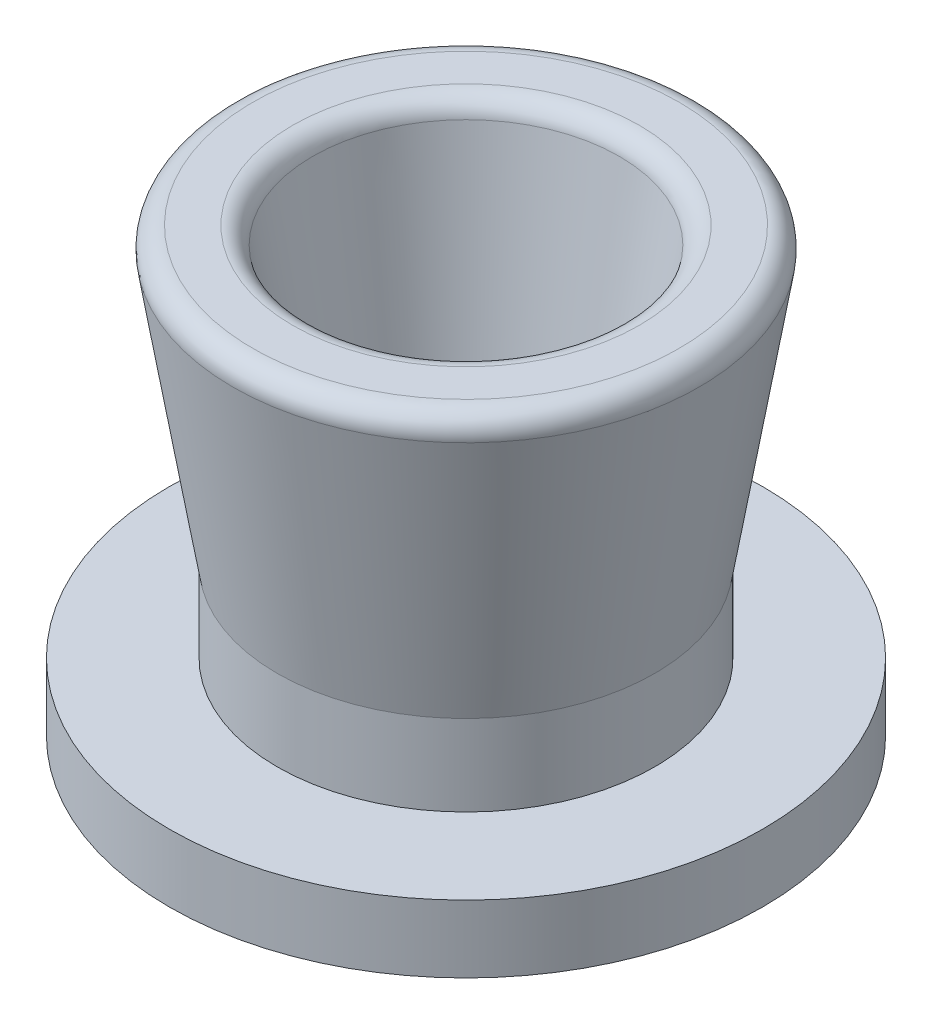
ISO-10303-21;
HEADER;
FILE_DESCRIPTION(('STEP AP214'),'2;1');
FILE_NAME('part.step','',(''),(''),'','','');
FILE_SCHEMA(('AUTOMOTIVE_DESIGN { 1 0 10303 214 1 1 1 1 }'));
ENDSEC;
DATA;
#1=APPLICATION_CONTEXT('core data for automotive mechanical design processes');
#2=APPLICATION_PROTOCOL_DEFINITION('international standard','automotive_design',2000,#1);
#3=PRODUCT_CONTEXT('',#1,'mechanical');
#4=PRODUCT('Part','Part','',(#3));
#5=PRODUCT_RELATED_PRODUCT_CATEGORY('part','',(#4));
#6=PRODUCT_DEFINITION_FORMATION('','',#4);
#7=PRODUCT_DEFINITION_CONTEXT('part definition',#1,'design');
#8=PRODUCT_DEFINITION('design','',#6,#7);
#9=PRODUCT_DEFINITION_SHAPE('','',#8);
#10=(LENGTH_UNIT() NAMED_UNIT(*) SI_UNIT(.MILLI.,.METRE.));
#11=(NAMED_UNIT(*) PLANE_ANGLE_UNIT() SI_UNIT($,.RADIAN.));
#12=(NAMED_UNIT(*) SI_UNIT($,.STERADIAN.) SOLID_ANGLE_UNIT());
#13=UNCERTAINTY_MEASURE_WITH_UNIT(LENGTH_MEASURE(1.E-05),#10,'distance_accuracy_value','');
#14=(GEOMETRIC_REPRESENTATION_CONTEXT(3) GLOBAL_UNCERTAINTY_ASSIGNED_CONTEXT((#13)) GLOBAL_UNIT_ASSIGNED_CONTEXT((#10,
#11,#12)) REPRESENTATION_CONTEXT('',''));
#15=CARTESIAN_POINT('',(0.,0.,0.));
#16=DIRECTION('',(0.,0.,1.));
#17=DIRECTION('',(1.,0.,0.));
#18=AXIS2_PLACEMENT_3D('',#15,#16,#17);
#19=CARTESIAN_POINT('',(0.,5.,0.));
#20=DIRECTION('',(0.,1.,0.));
#21=DIRECTION('',(0.,0.,1.));
#22=AXIS2_PLACEMENT_3D('',#19,#20,#21);
#23=PLANE('',#22);
#24=CARTESIAN_POINT('',(0.,5.,0.));
#25=DIRECTION('',(0.,1.,0.));
#26=DIRECTION('',(0.,0.,1.));
#27=AXIS2_PLACEMENT_3D('',#24,#25,#26);
#28=CIRCLE('',#27,22.);
#29=CARTESIAN_POINT('',(0.,5.,22.));
#30=VERTEX_POINT('',#29);
#31=EDGE_CURVE('E10',#30,#30,#28,.T.);
#32=ORIENTED_EDGE('',*,*,#31,.T.);
#33=EDGE_LOOP('',(#32));
#34=FACE_BOUND('',#33,.T.);
#35=CARTESIAN_POINT('',(0.,5.,0.));
#36=DIRECTION('',(0.,1.,0.));
#37=DIRECTION('',(0.,0.,1.));
#38=AXIS2_PLACEMENT_3D('',#35,#36,#37);
#39=CIRCLE('',#38,14.);
#40=CARTESIAN_POINT('',(0.,5.,14.));
#41=VERTEX_POINT('',#40);
#42=EDGE_CURVE('E47',#41,#41,#39,.T.);
#43=ORIENTED_EDGE('',*,*,#42,.F.);
#44=EDGE_LOOP('',(#43));
#45=FACE_BOUND('',#44,.T.);
#46=ADVANCED_FACE('F31',(#34,#45),#23,.T.);
#47=CARTESIAN_POINT('',(0.,0.,0.));
#48=DIRECTION('',(0.,1.,0.));
#49=DIRECTION('',(0.,0.,1.));
#50=AXIS2_PLACEMENT_3D('',#47,#48,#49);
#51=PLANE('',#50);
#52=CARTESIAN_POINT('',(0.,0.,0.));
#53=DIRECTION('',(0.,1.,0.));
#54=DIRECTION('',(0.,0.,1.));
#55=AXIS2_PLACEMENT_3D('',#52,#53,#54);
#56=CIRCLE('',#55,22.);
#57=CARTESIAN_POINT('',(0.,0.,22.));
#58=VERTEX_POINT('',#57);
#59=EDGE_CURVE('E35',#58,#58,#56,.T.);
#60=ORIENTED_EDGE('',*,*,#59,.F.);
#61=EDGE_LOOP('',(#60));
#62=FACE_BOUND('',#61,.T.);
#63=CARTESIAN_POINT('',(0.,0.,0.));
#64=DIRECTION('',(0.,1.,0.));
#65=DIRECTION('',(0.,0.,1.));
#66=AXIS2_PLACEMENT_3D('',#63,#64,#65);
#67=CIRCLE('',#66,8.);
#68=CARTESIAN_POINT('',(0.,0.,8.));
#69=VERTEX_POINT('',#68);
#70=EDGE_CURVE('E42',#69,#69,#67,.T.);
#71=ORIENTED_EDGE('',*,*,#70,.T.);
#72=EDGE_LOOP('',(#71));
#73=FACE_BOUND('',#72,.T.);
#74=ADVANCED_FACE('F83',(#62,#73),#51,.F.);
#75=CARTESIAN_POINT('',(0.,5.,0.));
#76=DIRECTION('',(0.,-1.,0.));
#77=DIRECTION('',(0.,0.,-1.));
#78=AXIS2_PLACEMENT_3D('',#75,#76,#77);
#79=CYLINDRICAL_SURFACE('',#78,22.);
#80=ORIENTED_EDGE('',*,*,#31,.F.);
#81=EDGE_LOOP('',(#80));
#82=FACE_BOUND('',#81,.T.);
#83=ORIENTED_EDGE('',*,*,#59,.T.);
#84=EDGE_LOOP('',(#83));
#85=FACE_BOUND('',#84,.T.);
#86=ADVANCED_FACE('F33',(#82,#85),#79,.T.);
#87=CARTESIAN_POINT('',(0.,5.,0.));
#88=DIRECTION('',(0.,-1.,0.));
#89=DIRECTION('',(0.,0.,-1.));
#90=AXIS2_PLACEMENT_3D('',#87,#88,#89);
#91=CYLINDRICAL_SURFACE('',#90,8.);
#92=ORIENTED_EDGE('',*,*,#70,.F.);
#93=EDGE_LOOP('',(#92));
#94=FACE_BOUND('',#93,.T.);
#95=CARTESIAN_POINT('',(0.,11.,0.));
#96=DIRECTION('',(0.,-1.,0.));
#97=DIRECTION('',(0.,0.,-1.));
#98=AXIS2_PLACEMENT_3D('',#95,#96,#97);
#99=CIRCLE('',#98,8.);
#100=CARTESIAN_POINT('',(0.,11.,-8.));
#101=VERTEX_POINT('',#100);
#102=EDGE_CURVE('E64',#101,#101,#99,.T.);
#103=ORIENTED_EDGE('',*,*,#102,.F.);
#104=EDGE_LOOP('',(#103));
#105=FACE_BOUND('',#104,.T.);
#106=ADVANCED_FACE('F71',(#94,#105),#91,.F.);
#107=CARTESIAN_POINT('',(0.,11.,0.));
#108=DIRECTION('',(0.,-1.,0.));
#109=DIRECTION('',(0.,0.,-1.));
#110=AXIS2_PLACEMENT_3D('',#107,#108,#109);
#111=CYLINDRICAL_SURFACE('',#110,14.);
#112=CARTESIAN_POINT('',(0.,11.,0.));
#113=DIRECTION('',(0.,1.,0.));
#114=DIRECTION('',(0.,0.,1.));
#115=AXIS2_PLACEMENT_3D('',#112,#113,#114);
#116=CIRCLE('',#115,14.);
#117=CARTESIAN_POINT('',(0.,11.,14.));
#118=VERTEX_POINT('',#117);
#119=EDGE_CURVE('E46',#118,#118,#116,.T.);
#120=ORIENTED_EDGE('',*,*,#119,.F.);
#121=EDGE_LOOP('',(#120));
#122=FACE_BOUND('',#121,.T.);
#123=ORIENTED_EDGE('',*,*,#42,.T.);
#124=EDGE_LOOP('',(#123));
#125=FACE_BOUND('',#124,.T.);
#126=ADVANCED_FACE('F73',(#122,#125),#111,.T.);
#127=CARTESIAN_POINT('',(0.,11.,0.));
#128=DIRECTION('',(0.,1.,0.));
#129=DIRECTION('',(0.,0.,1.));
#130=AXIS2_PLACEMENT_3D('',#127,#128,#129);
#131=CONICAL_SURFACE('',#130,14.,0.162797894963041);
#132=CARTESIAN_POINT('',(0.,31.033186052698,0.));
#133=DIRECTION('',(0.,-1.,0.));
#134=DIRECTION('',(0.,0.,-1.));
#135=AXIS2_PLACEMENT_3D('',#132,#133,#134);
#136=CIRCLE('',#135,17.2904813897853);
#137=CARTESIAN_POINT('',(0.,31.033186052698,-17.2904813897853));
#138=VERTEX_POINT('',#137);
#139=EDGE_CURVE('E50',#138,#138,#136,.T.);
#140=ORIENTED_EDGE('',*,*,#139,.T.);
#141=EDGE_LOOP('',(#140));
#142=FACE_BOUND('',#141,.T.);
#143=ORIENTED_EDGE('',*,*,#119,.T.);
#144=EDGE_LOOP('',(#143));
#145=FACE_BOUND('',#144,.T.);
#146=ADVANCED_FACE('F80',(#142,#145),#131,.T.);
#147=CARTESIAN_POINT('',(0.,31.2763056591966,0.));
#148=DIRECTION('',(0.,-1.,0.));
#149=DIRECTION('',(0.,0.,-1.));
#150=AXIS2_PLACEMENT_3D('',#147,#148,#149);
#151=TOROIDAL_SURFACE('',#150,15.8103148934289,1.5);
#152=CARTESIAN_POINT('',(0.,32.7763056591966,0.));
#153=DIRECTION('',(0.,-1.,0.));
#154=DIRECTION('',(0.,0.,-1.));
#155=AXIS2_PLACEMENT_3D('',#152,#153,#154);
#156=CIRCLE('',#155,15.8103148934289);
#157=CARTESIAN_POINT('',(0.,32.7763056591966,-15.8103148934289));
#158=VERTEX_POINT('',#157);
#159=EDGE_CURVE('E55',#158,#158,#156,.T.);
#160=ORIENTED_EDGE('',*,*,#159,.T.);
#161=EDGE_LOOP('',(#160));
#162=FACE_BOUND('',#161,.T.);
#163=ORIENTED_EDGE('',*,*,#139,.F.);
#164=EDGE_LOOP('',(#163));
#165=FACE_BOUND('',#164,.T.);
#166=ADVANCED_FACE('F128',(#162,#165),#151,.T.);
#167=CARTESIAN_POINT('',(12.8505134191199,32.7763056591966,0.));
#168=DIRECTION('',(0.,1.,0.));
#169=DIRECTION('',(0.,0.,1.));
#170=AXIS2_PLACEMENT_3D('',#167,#168,#169);
#171=PLANE('',#170);
#172=CARTESIAN_POINT('',(0.,32.7763056591966,0.));
#173=DIRECTION('',(0.,-1.,0.));
#174=DIRECTION('',(0.,0.,-1.));
#175=AXIS2_PLACEMENT_3D('',#172,#173,#174);
#176=CIRCLE('',#175,12.8505134191199);
#177=CARTESIAN_POINT('',(0.,32.7763056591966,-12.8505134191199));
#178=VERTEX_POINT('',#177);
#179=EDGE_CURVE('E58',#178,#178,#176,.T.);
#180=ORIENTED_EDGE('',*,*,#179,.T.);
#181=EDGE_LOOP('',(#180));
#182=FACE_BOUND('',#181,.T.);
#183=ORIENTED_EDGE('',*,*,#159,.F.);
#184=EDGE_LOOP('',(#183));
#185=FACE_BOUND('',#184,.T.);
#186=ADVANCED_FACE('F138',(#182,#185),#171,.T.);
#187=CARTESIAN_POINT('',(0.,31.2763056591966,0.));
#188=DIRECTION('',(0.,-1.,0.));
#189=DIRECTION('',(0.,0.,-1.));
#190=AXIS2_PLACEMENT_3D('',#187,#188,#189);
#191=TOROIDAL_SURFACE('',#190,12.8505134191199,1.5);
#192=CARTESIAN_POINT('',(0.,31.5194252656952,0.));
#193=DIRECTION('',(0.,-1.,0.));
#194=DIRECTION('',(0.,0.,-1.));
#195=AXIS2_PLACEMENT_3D('',#192,#193,#194);
#196=CIRCLE('',#195,11.3703469227635);
#197=CARTESIAN_POINT('',(0.,31.5194252656952,-11.3703469227635));
#198=VERTEX_POINT('',#197);
#199=EDGE_CURVE('E61',#198,#198,#196,.T.);
#200=ORIENTED_EDGE('',*,*,#199,.T.);
#201=EDGE_LOOP('',(#200));
#202=FACE_BOUND('',#201,.T.);
#203=ORIENTED_EDGE('',*,*,#179,.F.);
#204=EDGE_LOOP('',(#203));
#205=FACE_BOUND('',#204,.T.);
#206=ADVANCED_FACE('F148',(#202,#205),#191,.T.);
#207=CARTESIAN_POINT('',(0.,31.5194252656952,0.));
#208=DIRECTION('',(0.,1.,0.));
#209=DIRECTION('',(0.,0.,1.));
#210=AXIS2_PLACEMENT_3D('',#207,#208,#209);
#211=CONICAL_SURFACE('',#210,11.3703469227635,0.162797894963041);
#212=ORIENTED_EDGE('',*,*,#102,.T.);
#213=EDGE_LOOP('',(#212));
#214=FACE_BOUND('',#213,.T.);
#215=ORIENTED_EDGE('',*,*,#199,.F.);
#216=EDGE_LOOP('',(#215));
#217=FACE_BOUND('',#216,.T.);
#218=ADVANCED_FACE('F68',(#214,#217),#211,.F.);
#219=CLOSED_SHELL('',(#46,#74,#86,#106,#126,#146,#166,#186,#206,#218));
#220=MANIFOLD_SOLID_BREP('B2',#219);
#221=ADVANCED_BREP_SHAPE_REPRESENTATION('',(#18,#220),#14);
#222=SHAPE_DEFINITION_REPRESENTATION(#9,#221);
ENDSEC;
END-ISO-10303-21;
